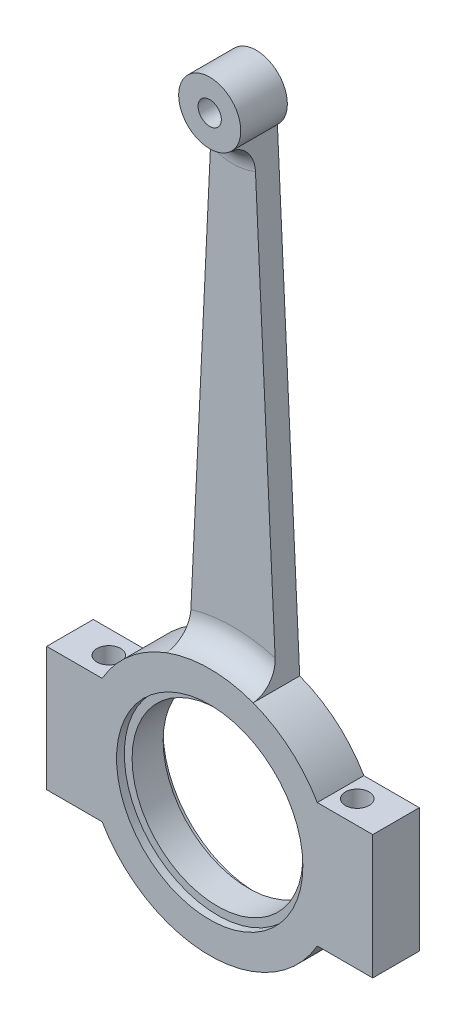
ISO-10303-21;
HEADER;
FILE_DESCRIPTION(('STEP AP214'),'2;1');
FILE_NAME('part.step','',(''),(''),'','','');
FILE_SCHEMA(('AUTOMOTIVE_DESIGN { 1 0 10303 214 1 1 1 1 }'));
ENDSEC;
DATA;
#1=APPLICATION_CONTEXT('core data for automotive mechanical design processes');
#2=APPLICATION_PROTOCOL_DEFINITION('international standard','automotive_design',2000,#1);
#3=PRODUCT_CONTEXT('',#1,'mechanical');
#4=PRODUCT('Part','Part','',(#3));
#5=PRODUCT_RELATED_PRODUCT_CATEGORY('part','',(#4));
#6=PRODUCT_DEFINITION_FORMATION('','',#4);
#7=PRODUCT_DEFINITION_CONTEXT('part definition',#1,'design');
#8=PRODUCT_DEFINITION('design','',#6,#7);
#9=PRODUCT_DEFINITION_SHAPE('','',#8);
#10=(LENGTH_UNIT() NAMED_UNIT(*) SI_UNIT(.MILLI.,.METRE.));
#11=(NAMED_UNIT(*) PLANE_ANGLE_UNIT() SI_UNIT($,.RADIAN.));
#12=(NAMED_UNIT(*) SI_UNIT($,.STERADIAN.) SOLID_ANGLE_UNIT());
#13=UNCERTAINTY_MEASURE_WITH_UNIT(LENGTH_MEASURE(1.E-05),#10,'distance_accuracy_value','');
#14=(GEOMETRIC_REPRESENTATION_CONTEXT(3) GLOBAL_UNCERTAINTY_ASSIGNED_CONTEXT((#13)) GLOBAL_UNIT_ASSIGNED_CONTEXT((#10,
#11,#12)) REPRESENTATION_CONTEXT('',''));
#15=CARTESIAN_POINT('',(0.,0.,0.));
#16=DIRECTION('',(0.,0.,1.));
#17=DIRECTION('',(1.,0.,0.));
#18=AXIS2_PLACEMENT_3D('',#15,#16,#17);
#19=CARTESIAN_POINT('',(0.,-123.825,9.525));
#20=DIRECTION('',(0.,0.,-1.));
#21=DIRECTION('',(-1.,0.,0.));
#22=AXIS2_PLACEMENT_3D('',#19,#20,#21);
#23=CYLINDRICAL_SURFACE('',#22,25.4);
#24=CARTESIAN_POINT('',(0.,-123.825,9.525));
#25=DIRECTION('',(0.,0.,1.));
#26=DIRECTION('',(1.,0.,0.));
#27=AXIS2_PLACEMENT_3D('',#24,#25,#26);
#28=CIRCLE('',#27,25.4);
#29=CARTESIAN_POINT('',(-8.87478990059472,-100.025880179715,9.525));
#30=VERTEX_POINT('',#29);
#31=CARTESIAN_POINT('',(-21.9970452561247,-111.125,9.525));
#32=VERTEX_POINT('',#31);
#33=EDGE_CURVE('E177',#30,#32,#28,.T.);
#34=ORIENTED_EDGE('',*,*,#33,.F.);
#35=DIRECTION('',(0.,0.,-1.));
#36=VECTOR('',#35,1.);
#37=CARTESIAN_POINT('',(-8.87478990059473,-100.025880179715,4.7625));
#38=LINE('',#37,#36);
#39=CARTESIAN_POINT('',(-8.87478990059473,-100.025880179715,0.));
#40=VERTEX_POINT('',#39);
#41=EDGE_CURVE('E282',#30,#40,#38,.T.);
#42=ORIENTED_EDGE('',*,*,#41,.T.);
#43=CARTESIAN_POINT('',(0.,-123.825,0.));
#44=DIRECTION('',(0.,0.,1.));
#45=DIRECTION('',(1.,0.,0.));
#46=AXIS2_PLACEMENT_3D('',#43,#44,#45);
#47=CIRCLE('',#46,25.4);
#48=CARTESIAN_POINT('',(-21.9970452561247,-111.125,0.));
#49=VERTEX_POINT('',#48);
#50=EDGE_CURVE('E214',#40,#49,#47,.T.);
#51=ORIENTED_EDGE('',*,*,#50,.T.);
#52=DIRECTION('',(0.,0.,-1.));
#53=VECTOR('',#52,1.);
#54=CARTESIAN_POINT('',(-21.9970452561247,-111.125,9.525));
#55=LINE('',#54,#53);
#56=EDGE_CURVE('E163',#32,#49,#55,.T.);
#57=ORIENTED_EDGE('',*,*,#56,.F.);
#58=EDGE_LOOP('',(#34,#42,#51,#57));
#59=FACE_BOUND('',#58,.T.);
#60=ADVANCED_FACE('F41',(#59),#23,.T.);
#61=CARTESIAN_POINT('',(0.,0.,9.525));
#62=DIRECTION('',(0.,0.,1.));
#63=DIRECTION('',(1.,0.,0.));
#64=AXIS2_PLACEMENT_3D('',#61,#62,#63);
#65=PLANE('',#64);
#66=CARTESIAN_POINT('',(0.,0.,9.525));
#67=DIRECTION('',(0.,0.,1.));
#68=DIRECTION('',(1.,0.,0.));
#69=AXIS2_PLACEMENT_3D('',#66,#67,#68);
#70=CIRCLE('',#69,6.35);
#71=CARTESIAN_POINT('',(-4.31825318171018,-4.65566208596049,9.525));
#72=VERTEX_POINT('',#71);
#73=CARTESIAN_POINT('',(4.31825318171018,-4.65566208596049,9.525));
#74=VERTEX_POINT('',#73);
#75=EDGE_CURVE('E306',#72,#74,#70,.T.);
#76=ORIENTED_EDGE('',*,*,#75,.T.);
#77=EDGE_CURVE('E311',#74,#72,#70,.T.);
#78=ORIENTED_EDGE('',*,*,#77,.T.);
#79=EDGE_LOOP('',(#76,#78));
#80=FACE_BOUND('',#79,.T.);
#81=CARTESIAN_POINT('',(0.,0.,9.525));
#82=DIRECTION('',(0.,0.,1.));
#83=DIRECTION('',(1.,0.,0.));
#84=AXIS2_PLACEMENT_3D('',#81,#82,#83);
#85=CIRCLE('',#84,2.38125);
#86=CARTESIAN_POINT('',(-2.38125,0.,9.525));
#87=VERTEX_POINT('',#86);
#88=EDGE_CURVE('E298',#87,#87,#85,.T.);
#89=ORIENTED_EDGE('',*,*,#88,.F.);
#90=EDGE_LOOP('',(#89));
#91=FACE_BOUND('',#90,.T.);
#92=ADVANCED_FACE('F349',(#80,#91),#65,.T.);
#93=CARTESIAN_POINT('',(0.,0.,0.));
#94=DIRECTION('',(0.,0.,1.));
#95=DIRECTION('',(1.,0.,0.));
#96=AXIS2_PLACEMENT_3D('',#93,#94,#95);
#97=PLANE('',#96);
#98=CARTESIAN_POINT('',(0.,0.,0.));
#99=DIRECTION('',(0.,0.,1.));
#100=DIRECTION('',(1.,0.,0.));
#101=AXIS2_PLACEMENT_3D('',#98,#99,#100);
#102=CIRCLE('',#101,6.35);
#103=CARTESIAN_POINT('',(4.31825318171018,-4.65566208596049,0.));
#104=VERTEX_POINT('',#103);
#105=CARTESIAN_POINT('',(-4.31825318171018,-4.65566208596049,0.));
#106=VERTEX_POINT('',#105);
#107=EDGE_CURVE('E302',#104,#106,#102,.T.);
#108=ORIENTED_EDGE('',*,*,#107,.F.);
#109=DIRECTION('',(0.0477229175808146,-0.998860612466812,0.));
#110=VECTOR('',#109,1.);
#111=CARTESIAN_POINT('',(4.08648983313829,0.195241673430361,0.));
#112=LINE('',#111,#110);
#113=CARTESIAN_POINT('',(8.87478990059473,-100.025880179715,0.));
#114=VERTEX_POINT('',#113);
#115=EDGE_CURVE('E162',#104,#114,#112,.T.);
#116=ORIENTED_EDGE('',*,*,#115,.T.);
#117=CARTESIAN_POINT('',(21.9970452561247,-111.125,0.));
#118=VERTEX_POINT('',#117);
#119=EDGE_CURVE('E216',#118,#114,#47,.T.);
#120=ORIENTED_EDGE('',*,*,#119,.F.);
#121=DIRECTION('',(1.,0.,0.));
#122=VECTOR('',#121,1.);
#123=CARTESIAN_POINT('',(0.,-111.125,0.));
#124=LINE('',#123,#122);
#125=CARTESIAN_POINT('',(33.3375,-111.125,0.));
#126=VERTEX_POINT('',#125);
#127=EDGE_CURVE('E157',#118,#126,#124,.T.);
#128=ORIENTED_EDGE('',*,*,#127,.T.);
#129=DIRECTION('',(0.,-1.,0.));
#130=VECTOR('',#129,1.);
#131=CARTESIAN_POINT('',(33.3375,0.,0.));
#132=LINE('',#131,#130);
#133=CARTESIAN_POINT('',(33.3375,-136.525,0.));
#134=VERTEX_POINT('',#133);
#135=EDGE_CURVE('E183',#126,#134,#132,.T.);
#136=ORIENTED_EDGE('',*,*,#135,.T.);
#137=DIRECTION('',(-1.,0.,0.));
#138=VECTOR('',#137,1.);
#139=CARTESIAN_POINT('',(0.,-136.525,0.));
#140=LINE('',#139,#138);
#141=CARTESIAN_POINT('',(21.9970452561247,-136.525,0.));
#142=VERTEX_POINT('',#141);
#143=EDGE_CURVE('E188',#134,#142,#140,.T.);
#144=ORIENTED_EDGE('',*,*,#143,.T.);
#145=CARTESIAN_POINT('',(0.,-123.825,0.));
#146=DIRECTION('',(0.,0.,1.));
#147=DIRECTION('',(1.,0.,0.));
#148=AXIS2_PLACEMENT_3D('',#145,#146,#147);
#149=CIRCLE('',#148,25.4);
#150=CARTESIAN_POINT('',(-21.9970452561247,-136.525,0.));
#151=VERTEX_POINT('',#150);
#152=EDGE_CURVE('E228',#151,#142,#149,.T.);
#153=ORIENTED_EDGE('',*,*,#152,.F.);
#154=DIRECTION('',(1.,0.,0.));
#155=VECTOR('',#154,1.);
#156=CARTESIAN_POINT('',(0.,-136.525,0.));
#157=LINE('',#156,#155);
#158=CARTESIAN_POINT('',(-33.3375,-136.525,0.));
#159=VERTEX_POINT('',#158);
#160=EDGE_CURVE('E225',#159,#151,#157,.T.);
#161=ORIENTED_EDGE('',*,*,#160,.F.);
#162=DIRECTION('',(0.,-1.,0.));
#163=VECTOR('',#162,1.);
#164=CARTESIAN_POINT('',(-33.3375,0.,0.));
#165=LINE('',#164,#163);
#166=CARTESIAN_POINT('',(-33.3375,-111.125,0.));
#167=VERTEX_POINT('',#166);
#168=EDGE_CURVE('E222',#167,#159,#165,.T.);
#169=ORIENTED_EDGE('',*,*,#168,.F.);
#170=DIRECTION('',(-1.,0.,0.));
#171=VECTOR('',#170,1.);
#172=CARTESIAN_POINT('',(1.35988300731615E-13,-111.125,0.));
#173=LINE('',#172,#171);
#174=EDGE_CURVE('E219',#49,#167,#173,.T.);
#175=ORIENTED_EDGE('',*,*,#174,.F.);
#176=ORIENTED_EDGE('',*,*,#50,.F.);
#177=DIRECTION('',(-0.0477229175808146,-0.998860612466812,0.));
#178=VECTOR('',#177,1.);
#179=CARTESIAN_POINT('',(-4.08648983313829,0.195241673430361,0.));
#180=LINE('',#179,#178);
#181=EDGE_CURVE('E278',#106,#40,#180,.T.);
#182=ORIENTED_EDGE('',*,*,#181,.F.);
#183=EDGE_LOOP('',(#108,#116,#120,#128,#136,#144,#153,#161,#169,#175,#176,#182));
#184=FACE_BOUND('',#183,.T.);
#185=CARTESIAN_POINT('',(0.,0.,0.));
#186=DIRECTION('',(0.,0.,1.));
#187=DIRECTION('',(1.,0.,0.));
#188=AXIS2_PLACEMENT_3D('',#185,#186,#187);
#189=CIRCLE('',#188,2.38125);
#190=CARTESIAN_POINT('',(-2.38125,0.,0.));
#191=VERTEX_POINT('',#190);
#192=EDGE_CURVE('E297',#191,#191,#189,.T.);
#193=ORIENTED_EDGE('',*,*,#192,.T.);
#194=EDGE_LOOP('',(#193));
#195=FACE_BOUND('',#194,.T.);
#196=CARTESIAN_POINT('',(0.,-123.825,0.));
#197=DIRECTION('',(0.,0.,-1.));
#198=DIRECTION('',(-1.,0.,0.));
#199=AXIS2_PLACEMENT_3D('',#196,#197,#198);
#200=CIRCLE('',#199,19.05);
#201=CARTESIAN_POINT('',(-19.05,-123.825,0.));
#202=VERTEX_POINT('',#201);
#203=EDGE_CURVE('E271',#202,#202,#200,.T.);
#204=ORIENTED_EDGE('',*,*,#203,.F.);
#205=EDGE_LOOP('',(#204));
#206=FACE_BOUND('',#205,.T.);
#207=ADVANCED_FACE('F346',(#184,#195,#206),#97,.F.);
#208=CARTESIAN_POINT('',(0.,0.,9.525));
#209=DIRECTION('',(0.,0.,-1.));
#210=DIRECTION('',(-1.,0.,0.));
#211=AXIS2_PLACEMENT_3D('',#208,#209,#210);
#212=CYLINDRICAL_SURFACE('',#211,6.35);
#213=ORIENTED_EDGE('',*,*,#77,.F.);
#214=DIRECTION('',(0.,0.,-1.));
#215=VECTOR('',#214,1.);
#216=CARTESIAN_POINT('',(4.31825318171018,-4.65566208596049,4.7625));
#217=LINE('',#216,#215);
#218=EDGE_CURVE('E63',#74,#104,#217,.T.);
#219=ORIENTED_EDGE('',*,*,#218,.T.);
#220=ORIENTED_EDGE('',*,*,#107,.T.);
#221=DIRECTION('',(0.,0.,-1.));
#222=VECTOR('',#221,1.);
#223=CARTESIAN_POINT('',(-4.31825318171018,-4.65566208596049,4.7625));
#224=LINE('',#223,#222);
#225=EDGE_CURVE('E71',#72,#106,#224,.T.);
#226=ORIENTED_EDGE('',*,*,#225,.F.);
#227=EDGE_LOOP('',(#213,#219,#220,#226));
#228=FACE_BOUND('',#227,.T.);
#229=ADVANCED_FACE('F341',(#228),#212,.T.);
#230=CARTESIAN_POINT('',(0.,0.,9.525));
#231=DIRECTION('',(0.,0.,-1.));
#232=DIRECTION('',(-1.,0.,0.));
#233=AXIS2_PLACEMENT_3D('',#230,#231,#232);
#234=CYLINDRICAL_SURFACE('',#233,2.38125);
#235=CARTESIAN_POINT('',(-2.38125,0.,9.525));
#236=CARTESIAN_POINT('',(-2.38125,0.,9.42578125));
#237=CARTESIAN_POINT('',(-2.38125,0.,9.3265625));
#238=CARTESIAN_POINT('',(-2.38125,0.,9.128125));
#239=CARTESIAN_POINT('',(-2.38125,0.,9.02890625));
#240=CARTESIAN_POINT('',(-2.38125,0.,8.83046875));
#241=CARTESIAN_POINT('',(-2.38125,0.,8.73125));
#242=CARTESIAN_POINT('',(-2.38125,0.,8.5328125));
#243=CARTESIAN_POINT('',(-2.38125,0.,8.43359375));
#244=CARTESIAN_POINT('',(-2.38125,0.,8.23515625));
#245=CARTESIAN_POINT('',(-2.38125,0.,8.1359375));
#246=CARTESIAN_POINT('',(-2.38125,0.,7.9375));
#247=CARTESIAN_POINT('',(-2.38125,0.,7.83828125));
#248=CARTESIAN_POINT('',(-2.38125,0.,7.63984375));
#249=CARTESIAN_POINT('',(-2.38125,0.,7.540625));
#250=CARTESIAN_POINT('',(-2.38125,0.,7.3421875));
#251=CARTESIAN_POINT('',(-2.38125,0.,7.24296875));
#252=CARTESIAN_POINT('',(-2.38125,0.,7.04453125));
#253=CARTESIAN_POINT('',(-2.38125,0.,6.9453125));
#254=CARTESIAN_POINT('',(-2.38125,0.,6.746875));
#255=CARTESIAN_POINT('',(-2.38125,0.,6.64765625));
#256=CARTESIAN_POINT('',(-2.38125,0.,6.44921875));
#257=CARTESIAN_POINT('',(-2.38125,0.,6.35));
#258=CARTESIAN_POINT('',(-2.38125,0.,6.1515625));
#259=CARTESIAN_POINT('',(-2.38125,0.,6.05234375));
#260=CARTESIAN_POINT('',(-2.38125,0.,5.85390625));
#261=CARTESIAN_POINT('',(-2.38125,0.,5.7546875));
#262=CARTESIAN_POINT('',(-2.38125,0.,5.55625));
#263=CARTESIAN_POINT('',(-2.38125,0.,5.45703125));
#264=CARTESIAN_POINT('',(-2.38125,0.,5.25859375));
#265=CARTESIAN_POINT('',(-2.38125,0.,5.159375));
#266=CARTESIAN_POINT('',(-2.38125,0.,4.9609375));
#267=CARTESIAN_POINT('',(-2.38125,0.,4.86171875));
#268=CARTESIAN_POINT('',(-2.38125,0.,4.66328125));
#269=CARTESIAN_POINT('',(-2.38125,0.,4.5640625));
#270=CARTESIAN_POINT('',(-2.38125,0.,4.365625));
#271=CARTESIAN_POINT('',(-2.38125,0.,4.26640625));
#272=CARTESIAN_POINT('',(-2.38125,0.,4.06796875));
#273=CARTESIAN_POINT('',(-2.38125,0.,3.96875));
#274=CARTESIAN_POINT('',(-2.38125,0.,3.7703125));
#275=CARTESIAN_POINT('',(-2.38125,0.,3.67109375));
#276=CARTESIAN_POINT('',(-2.38125,0.,3.47265625));
#277=CARTESIAN_POINT('',(-2.38125,0.,3.3734375));
#278=CARTESIAN_POINT('',(-2.38125,0.,3.175));
#279=CARTESIAN_POINT('',(-2.38125,0.,3.07578125));
#280=CARTESIAN_POINT('',(-2.38125,0.,2.87734375));
#281=CARTESIAN_POINT('',(-2.38125,0.,2.778125));
#282=CARTESIAN_POINT('',(-2.38125,0.,2.5796875));
#283=CARTESIAN_POINT('',(-2.38125,0.,2.48046875));
#284=CARTESIAN_POINT('',(-2.38125,0.,2.28203125));
#285=CARTESIAN_POINT('',(-2.38125,0.,2.1828125));
#286=CARTESIAN_POINT('',(-2.38125,0.,1.984375));
#287=CARTESIAN_POINT('',(-2.38125,0.,1.88515625));
#288=CARTESIAN_POINT('',(-2.38125,0.,1.68671875));
#289=CARTESIAN_POINT('',(-2.38125,0.,1.5875));
#290=CARTESIAN_POINT('',(-2.38125,0.,1.3890625));
#291=CARTESIAN_POINT('',(-2.38125,0.,1.28984375));
#292=CARTESIAN_POINT('',(-2.38125,0.,1.09140625));
#293=CARTESIAN_POINT('',(-2.38125,0.,0.992187500000001));
#294=CARTESIAN_POINT('',(-2.38125,0.,0.793750000000001));
#295=CARTESIAN_POINT('',(-2.38125,0.,0.69453125));
#296=CARTESIAN_POINT('',(-2.38125,0.,0.49609375));
#297=CARTESIAN_POINT('',(-2.38125,0.,0.396875));
#298=CARTESIAN_POINT('',(-2.38125,0.,0.1984375));
#299=CARTESIAN_POINT('',(-2.38125,0.,0.0992187500000001));
#300=CARTESIAN_POINT('',(-2.38125,0.,0.));
#301=B_SPLINE_CURVE_WITH_KNOTS('',3,(#235,#236,#237,#238,#239,#240,#241,#242,#243,#244,#245,
#246,#247,#248,#249,#250,#251,#252,#253,#254,#255,#256,#257,#258,#259,#260,#261,#262,#263,#264,
#265,#266,#267,#268,#269,#270,#271,#272,#273,#274,#275,#276,#277,#278,#279,#280,#281,#282,#283,
#284,#285,#286,#287,#288,#289,#290,#291,#292,#293,#294,#295,#296,#297,#298,#299,#300),
.UNSPECIFIED.,.F.,.F.,(4,2,2,2,2,2,2,2,2,2,2,2,2,2,2,2,2,2,2,2,2,2,2,2,2,2,2,2,2,2,2,2,4),(0.,
0.29765625,0.5953125,0.892968750000001,1.190625,1.48828125,1.7859375,2.08359375,2.38125,
2.67890625,2.9765625,3.27421875,3.571875,3.86953125,4.1671875,4.46484375,4.7625,5.06015625,
5.3578125,5.65546875,5.953125,6.25078125,6.5484375,6.84609375,7.14375,7.44140625,7.7390625,
8.03671875,8.334375,8.63203125,8.9296875,9.22734375,9.525),.UNSPECIFIED.);
#302=EDGE_CURVE('BSEAM345',#87,#191,#301,.T.);
#303=ORIENTED_EDGE('',*,*,#88,.T.);
#304=ORIENTED_EDGE('',*,*,#192,.F.);
#305=ORIENTED_EDGE('',*,*,#302,.T.);
#306=ORIENTED_EDGE('',*,*,#302,.F.);
#307=EDGE_LOOP('',(#303,#305,#304,#306));
#308=FACE_BOUND('',#307,.T.);
#309=ADVANCED_FACE('F345',(#308),#234,.F.);
#310=CARTESIAN_POINT('',(4.08648983313829,0.195241673430361,4.7625));
#311=DIRECTION('',(0.998860612466812,0.0477229175808146,0.));
#312=DIRECTION('',(-0.0477229175808146,0.998860612466812,0.));
#313=AXIS2_PLACEMENT_3D('',#310,#311,#312);
#314=PLANE('',#313);
#315=ORIENTED_EDGE('',*,*,#115,.F.);
#316=ORIENTED_EDGE('',*,*,#218,.F.);
#317=CARTESIAN_POINT('',(4.31825318171018,-4.65566208596049,9.525));
#318=CARTESIAN_POINT('',(4.31875457990315,-4.66615655971673,9.39602428371671));
#319=CARTESIAN_POINT('',(4.3195663927523,-4.68314814197578,9.26763693325829));
#320=CARTESIAN_POINT('',(4.32177359394429,-4.72934578550267,9.01325012501161));
#321=CARTESIAN_POINT('',(4.32316821076106,-4.75853569840767,8.88724773963512));
#322=CARTESIAN_POINT('',(4.32649125689037,-4.82808844288018,8.6395413707916));
#323=CARTESIAN_POINT('',(4.32841510156513,-4.86835531606254,8.51781016283218));
#324=CARTESIAN_POINT('',(4.33275690240574,-4.9592310224676,8.278257288787));
#325=CARTESIAN_POINT('',(4.33517501296103,-5.0098430871256,8.16043685767501));
#326=CARTESIAN_POINT('',(4.34044520752671,-5.12015046225148,7.92992877362391));
#327=CARTESIAN_POINT('',(4.34329489748226,-5.17979566415112,7.81721700667056));
#328=CARTESIAN_POINT('',(4.34939372547341,-5.30744668322921,7.59669218417544));
#329=CARTESIAN_POINT('',(4.35264283342695,-5.37545187077764,7.48887876055289));
#330=CARTESIAN_POINT('',(4.36294687008295,-5.59111966492824,7.1727364566328));
#331=CARTESIAN_POINT('',(4.37054852676269,-5.7502255166196,6.97213201296029));
#332=CARTESIAN_POINT('',(4.38820764208135,-6.11983818149802,6.56429948857492));
#333=CARTESIAN_POINT('',(4.39846311892126,-6.33448959840072,6.36086353860913));
#334=CARTESIAN_POINT('',(4.4202504071577,-6.79050664796587,5.98670125713834));
#335=CARTESIAN_POINT('',(4.43178249524672,-7.03187807191762,5.8159820386361));
#336=CARTESIAN_POINT('',(4.45787987539549,-7.57810714676506,5.48444679451407));
#337=CARTESIAN_POINT('',(4.4726306088904,-7.88684616441015,5.33000339018593));
#338=CARTESIAN_POINT('',(4.50313729546689,-8.52536386581687,5.0740021584721));
#339=CARTESIAN_POINT('',(4.51889248442239,-8.85512655610014,4.9724046556787));
#340=CARTESIAN_POINT('',(4.54485153965833,-9.39846043270398,4.8542167897515));
#341=CARTESIAN_POINT('',(4.55487857523549,-9.60833047849215,4.81998107064269));
#342=CARTESIAN_POINT('',(4.57504024201358,-10.0303225914473,4.77412500130972));
#343=CARTESIAN_POINT('',(4.58517476932753,-10.2424424842166,4.76248451736574));
#344=CARTESIAN_POINT('',(4.59531650433198,-10.4547132369607,4.7625));
#345=B_SPLINE_CURVE_WITH_KNOTS('',3,(#317,#318,#319,#320,#321,#322,#323,#324,#325,#326,#327,
#328,#329,#330,#331,#332,#333,#334,#335,#336,#337,#338,#339,#340,#341,#342,#343,#344),
.UNSPECIFIED.,.F.,.F.,(4,2,2,2,2,2,2,2,2,2,2,2,2,4),(0.,0.387961975392442,0.775411978815411,
1.15960586654646,1.54391994539636,1.92617536618843,2.30840201513701,3.07426652295181,
3.95883000464349,4.84358558321911,5.87553388602948,6.90670630498094,7.54422925826817,
8.18118387883585),.UNSPECIFIED.);
#346=CARTESIAN_POINT('',(4.59531650433198,-10.4547132369607,4.7625));
#347=VERTEX_POINT('',#346);
#348=EDGE_CURVE('E56',#74,#347,#345,.T.);
#349=ORIENTED_EDGE('',*,*,#348,.T.);
#350=DIRECTION('',(0.0477229175808146,-0.998860612466812,0.));
#351=VECTOR('',#350,1.);
#352=CARTESIAN_POINT('',(4.08648983313829,0.195241673430361,4.7625));
#353=LINE('',#352,#351);
#354=CARTESIAN_POINT('',(8.61547557594445,-94.5983229750871,4.7625));
#355=VERTEX_POINT('',#354);
#356=EDGE_CURVE('E273',#347,#355,#353,.T.);
#357=ORIENTED_EDGE('',*,*,#356,.T.);
#358=CARTESIAN_POINT('',(8.61547557594445,-94.5983229750871,4.7625));
#359=CARTESIAN_POINT('',(8.62312525275805,-94.7584339082518,4.76248923608136));
#360=CARTESIAN_POINT('',(8.6307746503763,-94.9185389977411,4.76926912822186));
#361=CARTESIAN_POINT('',(8.6460191050727,-95.2376118065018,4.79625715921481));
#362=CARTESIAN_POINT('',(8.65361416382361,-95.3965795607848,4.81646488289401));
#363=CARTESIAN_POINT('',(8.66870098007606,-95.7123529310231,4.87017098574402));
#364=CARTESIAN_POINT('',(8.67619267558521,-95.8691572494517,4.90367701019561));
#365=CARTESIAN_POINT('',(8.69101531836047,-96.1794013583917,4.98375432883136));
#366=CARTESIAN_POINT('',(8.6983462665205,-96.332841167613,5.03032555034045));
#367=CARTESIAN_POINT('',(8.71279779264627,-96.6353176499576,5.13628050699879));
#368=CARTESIAN_POINT('',(8.71991827954608,-96.7843524170328,5.195669698776));
#369=CARTESIAN_POINT('',(8.73389520409043,-97.0768952899017,5.32693845320405));
#370=CARTESIAN_POINT('',(8.7407515487509,-97.2204014494998,5.39882236607628));
#371=CARTESIAN_POINT('',(8.75414072457467,-97.5006424959762,5.55462916405372));
#372=CARTESIAN_POINT('',(8.76067372715467,-97.6373809706778,5.6385455762587));
#373=CARTESIAN_POINT('',(8.77336618318375,-97.9030393806323,5.81797720128511));
#374=CARTESIAN_POINT('',(8.77952565776542,-98.0319597581993,5.9134917570144));
#375=CARTESIAN_POINT('',(8.79130601960012,-98.2785276554232,6.11368525887864));
#376=CARTESIAN_POINT('',(8.79693481919399,-98.3963407836811,6.21815965080289));
#377=CARTESIAN_POINT('',(8.80772708687963,-98.6222274573558,6.43709928651617));
#378=CARTESIAN_POINT('',(8.81289074708966,-98.7303050238882,6.55156036665322));
#379=CARTESIAN_POINT('',(8.8227061159814,-98.9357447974769,6.78984707727064));
#380=CARTESIAN_POINT('',(8.82735759077145,-99.0331021090829,6.91367694285881));
#381=CARTESIAN_POINT('',(8.83609491838271,-99.2159780280652,7.16980439342414));
#382=CARTESIAN_POINT('',(8.84018083291826,-99.3014979271484,7.30210105219133));
#383=CARTESIAN_POINT('',(8.84749591399281,-99.4546056316385,7.5654321005549));
#384=CARTESIAN_POINT('',(8.85076326975362,-99.5229927534203,7.69600098382801));
#385=CARTESIAN_POINT('',(8.85672382324819,-99.6477496294884,7.9627656792442));
#386=CARTESIAN_POINT('',(8.8594170888162,-99.7041208035734,8.09896082431802));
#387=CARTESIAN_POINT('',(8.86419234419808,-99.8040688947049,8.37565620103864));
#388=CARTESIAN_POINT('',(8.86627559548663,-99.8476722149436,8.51614687528526));
#389=CARTESIAN_POINT('',(8.86981079025144,-99.9216653190322,8.80050425224564));
#390=CARTESIAN_POINT('',(8.87126315003218,-99.9520638163088,8.94436866247328));
#391=CARTESIAN_POINT('',(8.87295295316604,-99.9874321022143,9.1615262459966));
#392=CARTESIAN_POINT('',(8.87343437208158,-99.9975084013427,9.23401853237336));
#393=CARTESIAN_POINT('',(8.87423422083596,-100.014249570097,9.37929831707211));
#394=CARTESIAN_POINT('',(8.87455286824809,-100.020918993623,9.45208528954497));
#395=CARTESIAN_POINT('',(8.87478990059473,-100.025880179715,9.525));
#396=B_SPLINE_CURVE_WITH_KNOTS('',3,(#358,#359,#360,#361,#362,#363,#364,#365,#366,#367,#368,
#369,#370,#371,#372,#373,#374,#375,#376,#377,#378,#379,#380,#381,#382,#383,#384,#385,#386,#387,
#388,#389,#390,#391,#392,#393,#394,#395),.UNSPECIFIED.,.F.,.F.,(4,2,2,2,2,2,2,2,2,2,2,2,2,2,2,2,
2,2,4),(0.,0.480729396406373,0.96144392989931,1.44243523059978,1.92342385584213,
2.40461764390769,2.88597930349841,3.36708297870048,3.84815940970815,4.32024803633303,
4.79214077169175,5.26424811295124,5.73630389684432,6.17801575546164,6.61967539264589,
7.06041514623858,7.50086362678896,7.72036663567597,7.93957546660449),.UNSPECIFIED.);
#397=CARTESIAN_POINT('',(8.87478990059472,-100.025880179715,9.525));
#398=VERTEX_POINT('',#397);
#399=EDGE_CURVE('E326',#355,#398,#396,.T.);
#400=ORIENTED_EDGE('',*,*,#399,.T.);
#401=DIRECTION('',(0.,0.,-1.));
#402=VECTOR('',#401,1.);
#403=CARTESIAN_POINT('',(8.87478990059473,-100.025880179715,4.7625));
#404=LINE('',#403,#402);
#405=EDGE_CURVE('E168',#398,#114,#404,.T.);
#406=ORIENTED_EDGE('',*,*,#405,.T.);
#407=EDGE_LOOP('',(#315,#316,#349,#357,#400,#406));
#408=FACE_BOUND('',#407,.T.);
#409=ADVANCED_FACE('F355',(#408),#314,.T.);
#410=CARTESIAN_POINT('',(-4.08648983313829,0.195241673430361,4.7625));
#411=DIRECTION('',(0.998860612466812,-0.0477229175808146,0.));
#412=DIRECTION('',(0.0477229175808146,0.998860612466812,0.));
#413=AXIS2_PLACEMENT_3D('',#410,#411,#412);
#414=PLANE('',#413);
#415=ORIENTED_EDGE('',*,*,#181,.T.);
#416=ORIENTED_EDGE('',*,*,#41,.F.);
#417=CARTESIAN_POINT('',(-8.87478990059472,-100.025880179715,9.525));
#418=CARTESIAN_POINT('',(-8.87434867951005,-100.016645237988,9.38893524089033));
#419=CARTESIAN_POINT('',(-8.87362116296155,-100.001418012536,9.2532905942126));
#420=CARTESIAN_POINT('',(-8.87160734570927,-99.9592679756991,8.98387523371857));
#421=CARTESIAN_POINT('',(-8.87032121430255,-99.9323487077721,8.85010396481458));
#422=CARTESIAN_POINT('',(-8.86720885975302,-99.8672058261305,8.58582439112954));
#423=CARTESIAN_POINT('',(-8.8653844418541,-99.8290199969254,8.45530673660665));
#424=CARTESIAN_POINT('',(-8.86121434500341,-99.7417381267992,8.1979808596696));
#425=CARTESIAN_POINT('',(-8.85886864275941,-99.6926415983622,8.0711728032957));
#426=CARTESIAN_POINT('',(-8.85368262485091,-99.5840960758555,7.82222467399093));
#427=CARTESIAN_POINT('',(-8.85084280009843,-99.5246573567798,7.70008011336885));
#428=CARTESIAN_POINT('',(-8.84469489918246,-99.3959792208735,7.46106187714108));
#429=CARTESIAN_POINT('',(-8.84138664929434,-99.3267361679137,7.34419017838042));
#430=CARTESIAN_POINT('',(-8.83080184551369,-99.1051918004874,7.00249456465782));
#431=CARTESIAN_POINT('',(-8.82286305878151,-98.939029675883,6.78648661403097));
#432=CARTESIAN_POINT('',(-8.80511666970877,-98.5675903348524,6.37424048574314));
#433=CARTESIAN_POINT('',(-8.7952432091448,-98.3609346782826,6.17925757149227));
#434=CARTESIAN_POINT('',(-8.77416586136363,-97.9197769791913,5.82384508687113));
#435=CARTESIAN_POINT('',(-8.76296142790236,-97.6852635035533,5.66342977991127));
#436=CARTESIAN_POINT('',(-8.73865509579534,-97.1765218128525,5.36958522359116));
#437=CARTESIAN_POINT('',(-8.72547415269146,-96.9006391642416,5.23902873536654));
#438=CARTESIAN_POINT('',(-8.6982891249586,-96.331645170838,5.02378346131798));
#439=CARTESIAN_POINT('',(-8.68428538299513,-96.0385409981779,4.93907572917403));
#440=CARTESIAN_POINT('',(-8.66107482132763,-95.5527342407926,4.83975026743968));
#441=CARTESIAN_POINT('',(-8.65200195032678,-95.3628352584138,4.81080700474984));
#442=CARTESIAN_POINT('',(-8.63377914129277,-94.9814242484571,4.77219591720216));
#443=CARTESIAN_POINT('',(-8.62462936321492,-94.7899155688108,4.7624949252916));
#444=CARTESIAN_POINT('',(-8.61547557594445,-94.5983229750871,4.7625));
#445=B_SPLINE_CURVE_WITH_KNOTS('',3,(#417,#418,#419,#420,#421,#422,#423,#424,#425,#426,#427,
#428,#429,#430,#431,#432,#433,#434,#435,#436,#437,#438,#439,#440,#441,#442,#443,#444),
.UNSPECIFIED.,.F.,.F.,(4,2,2,2,2,2,2,2,2,2,2,2,2,4),(0.,0.408986664031376,0.817849464576019,
1.22535635862711,1.63288146471716,2.04000398153194,2.44727788512393,3.26149027486964,
4.11083609124707,4.9605316995087,5.87306053242111,6.78521198783957,7.36123316719728,
7.9362606184979),.UNSPECIFIED.);
#446=CARTESIAN_POINT('',(-8.61547557594445,-94.5983229750871,4.7625));
#447=VERTEX_POINT('',#446);
#448=EDGE_CURVE('E319',#30,#447,#445,.T.);
#449=ORIENTED_EDGE('',*,*,#448,.T.);
#450=DIRECTION('',(-0.0477229175808146,-0.998860612466812,0.));
#451=VECTOR('',#450,1.);
#452=CARTESIAN_POINT('',(-4.08648983313829,0.195241673430361,4.7625));
#453=LINE('',#452,#451);
#454=CARTESIAN_POINT('',(-4.59531650433198,-10.4547132369607,4.7625));
#455=VERTEX_POINT('',#454);
#456=EDGE_CURVE('E277',#455,#447,#453,.T.);
#457=ORIENTED_EDGE('',*,*,#456,.F.);
#458=CARTESIAN_POINT('',(-4.59531650433198,-10.4547132369607,4.7625));
#459=CARTESIAN_POINT('',(-4.58714075817885,-10.2835914526301,4.76248517390263));
#460=CARTESIAN_POINT('',(-4.57896657097548,-10.1125022977696,4.77005327979247));
#461=CARTESIAN_POINT('',(-4.56268279864319,-9.77167613646969,4.79994863674258));
#462=CARTESIAN_POINT('',(-4.55457319033612,-9.60193864490173,4.82227032632817));
#463=CARTESIAN_POINT('',(-4.53849680822307,-9.26545324757668,4.88118245584279));
#464=CARTESIAN_POINT('',(-4.53052969255005,-9.0986981863996,4.91773195026895));
#465=CARTESIAN_POINT('',(-4.514769652183,-8.76883395404457,5.00459359861634));
#466=CARTESIAN_POINT('',(-4.50697674193964,-8.6057250853254,5.05490688972254));
#467=CARTESIAN_POINT('',(-4.4839556564841,-8.12388414425482,5.22558239361339));
#468=CARTESIAN_POINT('',(-4.46905227655967,-7.811950173036,5.36580313207992));
#469=CARTESIAN_POINT('',(-4.44049700601689,-7.2142764248789,5.69498794374526));
#470=CARTESIAN_POINT('',(-4.42684712261486,-6.92857865981736,5.88402840827724));
#471=CARTESIAN_POINT('',(-4.40738890580354,-6.52131004869874,6.20457824827974));
#472=CARTESIAN_POINT('',(-4.40096730314879,-6.38690322099619,6.320012543751));
#473=CARTESIAN_POINT('',(-4.38863253014455,-6.12873126625801,6.56224233285632));
#474=CARTESIAN_POINT('',(-4.38271944660037,-6.00496795609345,6.68903975868702));
#475=CARTESIAN_POINT('',(-4.36586182283569,-5.65213084445194,7.08540206727003));
#476=CARTESIAN_POINT('',(-4.35576417857182,-5.44078292933751,7.37150267115446));
#477=CARTESIAN_POINT('',(-4.34125314040943,-5.13706083519135,7.88788743126528));
#478=CARTESIAN_POINT('',(-4.33604609449103,-5.02807518764809,8.10840824133516));
#479=CARTESIAN_POINT('',(-4.3295779986207,-4.8926952375101,8.44992445969258));
#480=CARTESIAN_POINT('',(-4.32764715262115,-4.85228182367326,8.5654145180153));
#481=CARTESIAN_POINT('',(-4.32426765975766,-4.78154762546058,8.79942530225776));
#482=CARTESIAN_POINT('',(-4.32281874671978,-4.7512212699528,8.91794431618794));
#483=CARTESIAN_POINT('',(-4.3208274892905,-4.70954341964066,9.11797885627896));
#484=CARTESIAN_POINT('',(-4.32014366439585,-4.69523067876659,9.19888622371295));
#485=CARTESIAN_POINT('',(-4.31901628330135,-4.67163412122933,9.36145232704697));
#486=CARTESIAN_POINT('',(-4.31857278767696,-4.66235157243613,9.44311124710766));
#487=CARTESIAN_POINT('',(-4.31825318171018,-4.65566208596049,9.525));
#488=B_SPLINE_CURVE_WITH_KNOTS('',3,(#458,#459,#460,#461,#462,#463,#464,#465,#466,#467,#468,
#469,#470,#471,#472,#473,#474,#475,#476,#477,#478,#479,#480,#481,#482,#483,#484,#485,#486,#487),
.UNSPECIFIED.,.F.,.F.,(4,2,2,2,2,2,2,2,2,2,2,2,2,2,4),(0.,0.513734025165501,1.02727450477661,
1.53934788900581,2.05146359427041,3.07362295869349,4.09739155573661,4.62863735949823,
5.15997366878707,6.21991819175655,6.95504155977944,7.32176746009127,7.68829047825299,
7.93464296313046,8.18105751279823),.UNSPECIFIED.);
#489=EDGE_CURVE('E11',#455,#72,#488,.T.);
#490=ORIENTED_EDGE('',*,*,#489,.T.);
#491=ORIENTED_EDGE('',*,*,#225,.T.);
#492=EDGE_LOOP('',(#415,#416,#449,#457,#490,#491));
#493=FACE_BOUND('',#492,.T.);
#494=ADVANCED_FACE('F332',(#493),#414,.F.);
#495=CARTESIAN_POINT('',(0.,0.,4.7625));
#496=DIRECTION('',(0.,0.,1.));
#497=DIRECTION('',(1.,0.,0.));
#498=AXIS2_PLACEMENT_3D('',#495,#496,#497);
#499=PLANE('',#498);
#500=ORIENTED_EDGE('',*,*,#456,.T.);
#501=CARTESIAN_POINT('',(0.,-123.825,4.7625));
#502=DIRECTION('',(0.,0.,1.));
#503=DIRECTION('',(1.,0.,0.));
#504=AXIS2_PLACEMENT_3D('',#501,#502,#503);
#505=CIRCLE('',#504,30.4700684166981);
#506=EDGE_CURVE('E316',#447,#355,#505,.F.);
#507=ORIENTED_EDGE('',*,*,#506,.T.);
#508=ORIENTED_EDGE('',*,*,#356,.F.);
#509=CARTESIAN_POINT('',(0.,0.,4.7625));
#510=DIRECTION('',(0.,0.,1.));
#511=DIRECTION('',(1.,0.,0.));
#512=AXIS2_PLACEMENT_3D('',#509,#510,#511);
#513=CIRCLE('',#512,11.4200684166981);
#514=EDGE_CURVE('E310',#347,#455,#513,.F.);
#515=ORIENTED_EDGE('',*,*,#514,.T.);
#516=EDGE_LOOP('',(#500,#507,#508,#515));
#517=FACE_BOUND('',#516,.T.);
#518=ADVANCED_FACE('F381',(#517),#499,.T.);
#519=CARTESIAN_POINT('',(0.,-123.825,9.525));
#520=DIRECTION('',(0.,0.,-1.));
#521=DIRECTION('',(-1.,0.,0.));
#522=AXIS2_PLACEMENT_3D('',#519,#520,#521);
#523=CYLINDRICAL_SURFACE('',#522,17.4625);
#524=CARTESIAN_POINT('',(0.,-123.825,7.9375));
#525=DIRECTION('',(0.,0.,1.));
#526=DIRECTION('',(1.,0.,0.));
#527=AXIS2_PLACEMENT_3D('',#524,#525,#526);
#528=CIRCLE('',#527,17.4625);
#529=CARTESIAN_POINT('',(-17.4625,-123.825,7.9375));
#530=VERTEX_POINT('',#529);
#531=EDGE_CURVE('E215',#530,#530,#528,.T.);
#532=CARTESIAN_POINT('',(0.,-123.825,1.5875));
#533=DIRECTION('',(0.,0.,-1.));
#534=DIRECTION('',(-1.,0.,0.));
#535=AXIS2_PLACEMENT_3D('',#532,#533,#534);
#536=CIRCLE('',#535,17.4625);
#537=CARTESIAN_POINT('',(-17.4625,-123.825,1.5875));
#538=VERTEX_POINT('',#537);
#539=EDGE_CURVE('E262',#538,#538,#536,.T.);
#540=CARTESIAN_POINT('',(-17.4625,-123.825,7.9375));
#541=CARTESIAN_POINT('',(-17.4625,-123.825,7.87135416666667));
#542=CARTESIAN_POINT('',(-17.4625,-123.825,7.80520833333333));
#543=CARTESIAN_POINT('',(-17.4625,-123.825,7.67291666666667));
#544=CARTESIAN_POINT('',(-17.4625,-123.825,7.60677083333333));
#545=CARTESIAN_POINT('',(-17.4625,-123.825,7.47447916666667));
#546=CARTESIAN_POINT('',(-17.4625,-123.825,7.40833333333333));
#547=CARTESIAN_POINT('',(-17.4625,-123.825,7.27604166666667));
#548=CARTESIAN_POINT('',(-17.4625,-123.825,7.20989583333333));
#549=CARTESIAN_POINT('',(-17.4625,-123.825,7.07760416666667));
#550=CARTESIAN_POINT('',(-17.4625,-123.825,7.01145833333333));
#551=CARTESIAN_POINT('',(-17.4625,-123.825,6.87916666666667));
#552=CARTESIAN_POINT('',(-17.4625,-123.825,6.81302083333333));
#553=CARTESIAN_POINT('',(-17.4625,-123.825,6.68072916666667));
#554=CARTESIAN_POINT('',(-17.4625,-123.825,6.61458333333333));
#555=CARTESIAN_POINT('',(-17.4625,-123.825,6.48229166666667));
#556=CARTESIAN_POINT('',(-17.4625,-123.825,6.41614583333333));
#557=CARTESIAN_POINT('',(-17.4625,-123.825,6.28385416666667));
#558=CARTESIAN_POINT('',(-17.4625,-123.825,6.21770833333333));
#559=CARTESIAN_POINT('',(-17.4625,-123.825,6.08541666666667));
#560=CARTESIAN_POINT('',(-17.4625,-123.825,6.01927083333333));
#561=CARTESIAN_POINT('',(-17.4625,-123.825,5.88697916666667));
#562=CARTESIAN_POINT('',(-17.4625,-123.825,5.82083333333333));
#563=CARTESIAN_POINT('',(-17.4625,-123.825,5.68854166666667));
#564=CARTESIAN_POINT('',(-17.4625,-123.825,5.62239583333333));
#565=CARTESIAN_POINT('',(-17.4625,-123.825,5.49010416666667));
#566=CARTESIAN_POINT('',(-17.4625,-123.825,5.42395833333333));
#567=CARTESIAN_POINT('',(-17.4625,-123.825,5.29166666666667));
#568=CARTESIAN_POINT('',(-17.4625,-123.825,5.22552083333333));
#569=CARTESIAN_POINT('',(-17.4625,-123.825,5.09322916666667));
#570=CARTESIAN_POINT('',(-17.4625,-123.825,5.02708333333333));
#571=CARTESIAN_POINT('',(-17.4625,-123.825,4.89479166666667));
#572=CARTESIAN_POINT('',(-17.4625,-123.825,4.82864583333333));
#573=CARTESIAN_POINT('',(-17.4625,-123.825,4.69635416666667));
#574=CARTESIAN_POINT('',(-17.4625,-123.825,4.63020833333333));
#575=CARTESIAN_POINT('',(-17.4625,-123.825,4.49791666666667));
#576=CARTESIAN_POINT('',(-17.4625,-123.825,4.43177083333333));
#577=CARTESIAN_POINT('',(-17.4625,-123.825,4.29947916666667));
#578=CARTESIAN_POINT('',(-17.4625,-123.825,4.23333333333333));
#579=CARTESIAN_POINT('',(-17.4625,-123.825,4.10104166666667));
#580=CARTESIAN_POINT('',(-17.4625,-123.825,4.03489583333333));
#581=CARTESIAN_POINT('',(-17.4625,-123.825,3.90260416666667));
#582=CARTESIAN_POINT('',(-17.4625,-123.825,3.83645833333333));
#583=CARTESIAN_POINT('',(-17.4625,-123.825,3.70416666666667));
#584=CARTESIAN_POINT('',(-17.4625,-123.825,3.63802083333333));
#585=CARTESIAN_POINT('',(-17.4625,-123.825,3.50572916666667));
#586=CARTESIAN_POINT('',(-17.4625,-123.825,3.43958333333333));
#587=CARTESIAN_POINT('',(-17.4625,-123.825,3.30729166666667));
#588=CARTESIAN_POINT('',(-17.4625,-123.825,3.24114583333333));
#589=CARTESIAN_POINT('',(-17.4625,-123.825,3.10885416666667));
#590=CARTESIAN_POINT('',(-17.4625,-123.825,3.04270833333333));
#591=CARTESIAN_POINT('',(-17.4625,-123.825,2.91041666666667));
#592=CARTESIAN_POINT('',(-17.4625,-123.825,2.84427083333334));
#593=CARTESIAN_POINT('',(-17.4625,-123.825,2.71197916666667));
#594=CARTESIAN_POINT('',(-17.4625,-123.825,2.64583333333333));
#595=CARTESIAN_POINT('',(-17.4625,-123.825,2.51354166666667));
#596=CARTESIAN_POINT('',(-17.4625,-123.825,2.44739583333333));
#597=CARTESIAN_POINT('',(-17.4625,-123.825,2.31510416666667));
#598=CARTESIAN_POINT('',(-17.4625,-123.825,2.24895833333333));
#599=CARTESIAN_POINT('',(-17.4625,-123.825,2.11666666666667));
#600=CARTESIAN_POINT('',(-17.4625,-123.825,2.05052083333333));
#601=CARTESIAN_POINT('',(-17.4625,-123.825,1.91822916666667));
#602=CARTESIAN_POINT('',(-17.4625,-123.825,1.85208333333333));
#603=CARTESIAN_POINT('',(-17.4625,-123.825,1.71979166666667));
#604=CARTESIAN_POINT('',(-17.4625,-123.825,1.65364583333334));
#605=CARTESIAN_POINT('',(-17.4625,-123.825,1.5875));
#606=B_SPLINE_CURVE_WITH_KNOTS('',3,(#540,#541,#542,#543,#544,#545,#546,#547,#548,#549,#550,
#551,#552,#553,#554,#555,#556,#557,#558,#559,#560,#561,#562,#563,#564,#565,#566,#567,#568,#569,
#570,#571,#572,#573,#574,#575,#576,#577,#578,#579,#580,#581,#582,#583,#584,#585,#586,#587,#588,
#589,#590,#591,#592,#593,#594,#595,#596,#597,#598,#599,#600,#601,#602,#603,#604,#605),
.UNSPECIFIED.,.F.,.F.,(4,2,2,2,2,2,2,2,2,2,2,2,2,2,2,2,2,2,2,2,2,2,2,2,2,2,2,2,2,2,2,2,4),(0.,
0.198437499999999,0.396875,0.595312499999999,0.793749999999999,0.992187499999998,1.190625,
1.3890625,1.5875,1.7859375,1.984375,2.1828125,2.38125,2.5796875,2.778125,2.9765625,3.175,
3.3734375,3.571875,3.7703125,3.96875,4.1671875,4.365625,4.5640625,4.7625,4.9609375,5.159375,
5.3578125,5.55625,5.7546875,5.953125,6.1515625,6.35),.UNSPECIFIED.);
#607=EDGE_CURVE('BSEAM464',#530,#538,#606,.T.);
#608=ORIENTED_EDGE('',*,*,#531,.T.);
#609=ORIENTED_EDGE('',*,*,#539,.T.);
#610=ORIENTED_EDGE('',*,*,#607,.T.);
#611=ORIENTED_EDGE('',*,*,#607,.F.);
#612=EDGE_LOOP('',(#608,#610,#609,#611));
#613=FACE_BOUND('',#612,.T.);
#614=ADVANCED_FACE('F464',(#613),#523,.F.);
#615=CARTESIAN_POINT('',(0.,-111.125,9.525));
#616=DIRECTION('',(0.,1.,0.));
#617=DIRECTION('',(0.,0.,1.));
#618=AXIS2_PLACEMENT_3D('',#615,#616,#617);
#619=PLANE('',#618);
#620=CARTESIAN_POINT('',(25.4000000000001,-111.125,4.76250000000028));
#621=DIRECTION('',(0.,1.,0.));
#622=DIRECTION('',(0.,0.,1.));
#623=AXIS2_PLACEMENT_3D('',#620,#621,#622);
#624=CIRCLE('',#623,2.42569999999999);
#625=CARTESIAN_POINT('',(25.4000000000001,-111.125,7.18820000000026));
#626=VERTEX_POINT('',#625);
#627=EDGE_CURVE('E272',#626,#626,#624,.T.);
#628=ORIENTED_EDGE('',*,*,#627,.F.);
#629=EDGE_LOOP('',(#628));
#630=FACE_BOUND('',#629,.T.);
#631=ORIENTED_EDGE('',*,*,#127,.F.);
#632=DIRECTION('',(0.,0.,-1.));
#633=VECTOR('',#632,1.);
#634=CARTESIAN_POINT('',(21.9970452561247,-111.125,9.525));
#635=LINE('',#634,#633);
#636=CARTESIAN_POINT('',(21.9970452561247,-111.125,9.525));
#637=VERTEX_POINT('',#636);
#638=EDGE_CURVE('E150',#637,#118,#635,.T.);
#639=ORIENTED_EDGE('',*,*,#638,.F.);
#640=DIRECTION('',(1.,0.,0.));
#641=VECTOR('',#640,1.);
#642=CARTESIAN_POINT('',(0.,-111.125,9.525));
#643=LINE('',#642,#641);
#644=CARTESIAN_POINT('',(33.3375,-111.125,9.525));
#645=VERTEX_POINT('',#644);
#646=EDGE_CURVE('E154',#637,#645,#643,.T.);
#647=ORIENTED_EDGE('',*,*,#646,.T.);
#648=DIRECTION('',(0.,0.,-1.));
#649=VECTOR('',#648,1.);
#650=CARTESIAN_POINT('',(33.3375,-111.125,9.525));
#651=LINE('',#650,#649);
#652=EDGE_CURVE('E211',#645,#126,#651,.T.);
#653=ORIENTED_EDGE('',*,*,#652,.T.);
#654=EDGE_LOOP('',(#631,#639,#647,#653));
#655=FACE_BOUND('',#654,.T.);
#656=ADVANCED_FACE('F152',(#630,#655),#619,.T.);
#657=ORIENTED_EDGE('',*,*,#405,.F.);
#658=EDGE_CURVE('E166',#637,#398,#28,.T.);
#659=ORIENTED_EDGE('',*,*,#658,.F.);
#660=ORIENTED_EDGE('',*,*,#638,.T.);
#661=ORIENTED_EDGE('',*,*,#119,.T.);
#662=EDGE_LOOP('',(#657,#659,#660,#661));
#663=FACE_BOUND('',#662,.T.);
#664=ADVANCED_FACE('F167',(#663),#23,.T.);
#665=CARTESIAN_POINT('',(1.35988300731615E-13,-111.125,9.525));
#666=DIRECTION('',(0.,-1.,0.));
#667=DIRECTION('',(1.,0.,0.));
#668=AXIS2_PLACEMENT_3D('',#665,#666,#667);
#669=PLANE('',#668);
#670=CARTESIAN_POINT('',(-25.3999999999999,-111.125,4.76250000000028));
#671=DIRECTION('',(0.,1.,0.));
#672=DIRECTION('',(0.,0.,1.));
#673=AXIS2_PLACEMENT_3D('',#670,#671,#672);
#674=CIRCLE('',#673,2.42569999999999);
#675=CARTESIAN_POINT('',(-25.3999999999999,-111.125,7.18820000000026));
#676=VERTEX_POINT('',#675);
#677=EDGE_CURVE('E408',#676,#676,#674,.T.);
#678=ORIENTED_EDGE('',*,*,#677,.F.);
#679=EDGE_LOOP('',(#678));
#680=FACE_BOUND('',#679,.T.);
#681=ORIENTED_EDGE('',*,*,#174,.T.);
#682=DIRECTION('',(0.,0.,-1.));
#683=VECTOR('',#682,1.);
#684=CARTESIAN_POINT('',(-33.3375,-111.125,9.525));
#685=LINE('',#684,#683);
#686=CARTESIAN_POINT('',(-33.3375,-111.125,9.525));
#687=VERTEX_POINT('',#686);
#688=EDGE_CURVE('E251',#687,#167,#685,.T.);
#689=ORIENTED_EDGE('',*,*,#688,.F.);
#690=DIRECTION('',(-1.,0.,0.));
#691=VECTOR('',#690,1.);
#692=CARTESIAN_POINT('',(1.35988300731615E-13,-111.125,9.525));
#693=LINE('',#692,#691);
#694=EDGE_CURVE('E174',#32,#687,#693,.T.);
#695=ORIENTED_EDGE('',*,*,#694,.F.);
#696=ORIENTED_EDGE('',*,*,#56,.T.);
#697=EDGE_LOOP('',(#681,#689,#695,#696));
#698=FACE_BOUND('',#697,.T.);
#699=ADVANCED_FACE('F416',(#680,#698),#669,.F.);
#700=CARTESIAN_POINT('',(-33.3375,0.,9.525));
#701=DIRECTION('',(1.,0.,0.));
#702=DIRECTION('',(0.,0.,-1.));
#703=AXIS2_PLACEMENT_3D('',#700,#701,#702);
#704=PLANE('',#703);
#705=ORIENTED_EDGE('',*,*,#168,.T.);
#706=DIRECTION('',(0.,0.,-1.));
#707=VECTOR('',#706,1.);
#708=CARTESIAN_POINT('',(-33.3375,-136.525,9.525));
#709=LINE('',#708,#707);
#710=CARTESIAN_POINT('',(-33.3375,-136.525,9.525));
#711=VERTEX_POINT('',#710);
#712=EDGE_CURVE('E247',#711,#159,#709,.T.);
#713=ORIENTED_EDGE('',*,*,#712,.F.);
#714=DIRECTION('',(0.,-1.,0.));
#715=VECTOR('',#714,1.);
#716=CARTESIAN_POINT('',(-33.3375,0.,9.525));
#717=LINE('',#716,#715);
#718=EDGE_CURVE('E196',#687,#711,#717,.T.);
#719=ORIENTED_EDGE('',*,*,#718,.F.);
#720=ORIENTED_EDGE('',*,*,#688,.T.);
#721=EDGE_LOOP('',(#705,#713,#719,#720));
#722=FACE_BOUND('',#721,.T.);
#723=ADVANCED_FACE('F419',(#722),#704,.F.);
#724=CARTESIAN_POINT('',(0.,-136.525,9.525));
#725=DIRECTION('',(0.,1.,0.));
#726=DIRECTION('',(0.,0.,1.));
#727=AXIS2_PLACEMENT_3D('',#724,#725,#726);
#728=PLANE('',#727);
#729=CARTESIAN_POINT('',(-25.3999999999999,-136.525,4.76250000000028));
#730=DIRECTION('',(0.,1.,0.));
#731=DIRECTION('',(0.,0.,1.));
#732=AXIS2_PLACEMENT_3D('',#729,#730,#731);
#733=CIRCLE('',#732,2.42569999999999);
#734=CARTESIAN_POINT('',(-25.3999999999999,-136.525,7.18820000000027));
#735=VERTEX_POINT('',#734);
#736=EDGE_CURVE('E404',#735,#735,#733,.T.);
#737=ORIENTED_EDGE('',*,*,#736,.T.);
#738=EDGE_LOOP('',(#737));
#739=FACE_BOUND('',#738,.T.);
#740=ORIENTED_EDGE('',*,*,#160,.T.);
#741=DIRECTION('',(0.,0.,-1.));
#742=VECTOR('',#741,1.);
#743=CARTESIAN_POINT('',(-21.9970452561247,-136.525,9.525));
#744=LINE('',#743,#742);
#745=CARTESIAN_POINT('',(-21.9970452561247,-136.525,9.525));
#746=VERTEX_POINT('',#745);
#747=EDGE_CURVE('E243',#746,#151,#744,.T.);
#748=ORIENTED_EDGE('',*,*,#747,.F.);
#749=DIRECTION('',(1.,0.,0.));
#750=VECTOR('',#749,1.);
#751=CARTESIAN_POINT('',(0.,-136.525,9.525));
#752=LINE('',#751,#750);
#753=EDGE_CURVE('E199',#711,#746,#752,.T.);
#754=ORIENTED_EDGE('',*,*,#753,.F.);
#755=ORIENTED_EDGE('',*,*,#712,.T.);
#756=EDGE_LOOP('',(#740,#748,#754,#755));
#757=FACE_BOUND('',#756,.T.);
#758=ADVANCED_FACE('F430',(#739,#757),#728,.F.);
#759=CARTESIAN_POINT('',(0.,-123.825,9.525));
#760=DIRECTION('',(0.,0.,-1.));
#761=DIRECTION('',(-1.,0.,0.));
#762=AXIS2_PLACEMENT_3D('',#759,#760,#761);
#763=CYLINDRICAL_SURFACE('',#762,25.4);
#764=ORIENTED_EDGE('',*,*,#152,.T.);
#765=DIRECTION('',(0.,0.,-1.));
#766=VECTOR('',#765,1.);
#767=CARTESIAN_POINT('',(21.9970452561247,-136.525,9.525));
#768=LINE('',#767,#766);
#769=CARTESIAN_POINT('',(21.9970452561247,-136.525,9.525));
#770=VERTEX_POINT('',#769);
#771=EDGE_CURVE('E240',#770,#142,#768,.T.);
#772=ORIENTED_EDGE('',*,*,#771,.F.);
#773=CARTESIAN_POINT('',(0.,-123.825,9.525));
#774=DIRECTION('',(0.,0.,1.));
#775=DIRECTION('',(1.,0.,0.));
#776=AXIS2_PLACEMENT_3D('',#773,#774,#775);
#777=CIRCLE('',#776,25.4);
#778=EDGE_CURVE('E202',#746,#770,#777,.T.);
#779=ORIENTED_EDGE('',*,*,#778,.F.);
#780=ORIENTED_EDGE('',*,*,#747,.T.);
#781=EDGE_LOOP('',(#764,#772,#779,#780));
#782=FACE_BOUND('',#781,.T.);
#783=ADVANCED_FACE('F434',(#782),#763,.T.);
#784=CARTESIAN_POINT('',(0.,-136.525,9.525));
#785=DIRECTION('',(0.,-1.,0.));
#786=DIRECTION('',(0.,0.,-1.));
#787=AXIS2_PLACEMENT_3D('',#784,#785,#786);
#788=PLANE('',#787);
#789=CARTESIAN_POINT('',(25.4000000000001,-136.525,4.76250000000028));
#790=DIRECTION('',(0.,-1.,0.));
#791=DIRECTION('',(0.,0.,-1.));
#792=AXIS2_PLACEMENT_3D('',#789,#790,#791);
#793=CIRCLE('',#792,2.42569999999999);
#794=CARTESIAN_POINT('',(25.4000000000001,-136.525,2.33680000000029));
#795=VERTEX_POINT('',#794);
#796=EDGE_CURVE('E267',#795,#795,#793,.T.);
#797=ORIENTED_EDGE('',*,*,#796,.F.);
#798=EDGE_LOOP('',(#797));
#799=FACE_BOUND('',#798,.T.);
#800=ORIENTED_EDGE('',*,*,#143,.F.);
#801=DIRECTION('',(0.,0.,-1.));
#802=VECTOR('',#801,1.);
#803=CARTESIAN_POINT('',(33.3375,-136.525,9.525));
#804=LINE('',#803,#802);
#805=CARTESIAN_POINT('',(33.3375,-136.525,9.525));
#806=VERTEX_POINT('',#805);
#807=EDGE_CURVE('E237',#806,#134,#804,.T.);
#808=ORIENTED_EDGE('',*,*,#807,.F.);
#809=DIRECTION('',(-1.,0.,0.));
#810=VECTOR('',#809,1.);
#811=CARTESIAN_POINT('',(0.,-136.525,9.525));
#812=LINE('',#811,#810);
#813=EDGE_CURVE('E205',#806,#770,#812,.T.);
#814=ORIENTED_EDGE('',*,*,#813,.T.);
#815=ORIENTED_EDGE('',*,*,#771,.T.);
#816=EDGE_LOOP('',(#800,#808,#814,#815));
#817=FACE_BOUND('',#816,.T.);
#818=ADVANCED_FACE('F441',(#799,#817),#788,.T.);
#819=CARTESIAN_POINT('',(33.3375,0.,9.525));
#820=DIRECTION('',(1.,0.,0.));
#821=DIRECTION('',(0.,0.,-1.));
#822=AXIS2_PLACEMENT_3D('',#819,#820,#821);
#823=PLANE('',#822);
#824=ORIENTED_EDGE('',*,*,#135,.F.);
#825=ORIENTED_EDGE('',*,*,#652,.F.);
#826=DIRECTION('',(0.,-1.,0.));
#827=VECTOR('',#826,1.);
#828=CARTESIAN_POINT('',(33.3375,0.,9.525));
#829=LINE('',#828,#827);
#830=EDGE_CURVE('E181',#645,#806,#829,.T.);
#831=ORIENTED_EDGE('',*,*,#830,.T.);
#832=ORIENTED_EDGE('',*,*,#807,.T.);
#833=EDGE_LOOP('',(#824,#825,#831,#832));
#834=FACE_BOUND('',#833,.T.);
#835=ADVANCED_FACE('F439',(#834),#823,.T.);
#836=CARTESIAN_POINT('',(0.,0.,9.525));
#837=DIRECTION('',(0.,0.,1.));
#838=DIRECTION('',(1.,0.,0.));
#839=AXIS2_PLACEMENT_3D('',#836,#837,#838);
#840=PLANE('',#839);
#841=CARTESIAN_POINT('',(0.,-123.825,9.525));
#842=DIRECTION('',(0.,0.,1.));
#843=DIRECTION('',(1.,0.,0.));
#844=AXIS2_PLACEMENT_3D('',#841,#842,#843);
#845=CIRCLE('',#844,19.05);
#846=CARTESIAN_POINT('',(19.05,-123.825,9.525));
#847=VERTEX_POINT('',#846);
#848=EDGE_CURVE('E191',#847,#847,#845,.T.);
#849=ORIENTED_EDGE('',*,*,#848,.F.);
#850=EDGE_LOOP('',(#849));
#851=FACE_BOUND('',#850,.T.);
#852=ORIENTED_EDGE('',*,*,#646,.F.);
#853=ORIENTED_EDGE('',*,*,#658,.T.);
#854=EDGE_CURVE('E175',#398,#30,#28,.T.);
#855=ORIENTED_EDGE('',*,*,#854,.T.);
#856=ORIENTED_EDGE('',*,*,#33,.T.);
#857=ORIENTED_EDGE('',*,*,#694,.T.);
#858=ORIENTED_EDGE('',*,*,#718,.T.);
#859=ORIENTED_EDGE('',*,*,#753,.T.);
#860=ORIENTED_EDGE('',*,*,#778,.T.);
#861=ORIENTED_EDGE('',*,*,#813,.F.);
#862=ORIENTED_EDGE('',*,*,#830,.F.);
#863=EDGE_LOOP('',(#852,#853,#855,#856,#857,#858,#859,#860,#861,#862));
#864=FACE_BOUND('',#863,.T.);
#865=ADVANCED_FACE('F178',(#851,#864),#840,.T.);
#866=CARTESIAN_POINT('',(0.,-123.825,7.9375));
#867=DIRECTION('',(0.,0.,1.));
#868=DIRECTION('',(1.,0.,0.));
#869=AXIS2_PLACEMENT_3D('',#866,#867,#868);
#870=CYLINDRICAL_SURFACE('',#869,19.05);
#871=CARTESIAN_POINT('',(0.,-123.825,7.9375));
#872=DIRECTION('',(0.,0.,1.));
#873=DIRECTION('',(1.,0.,0.));
#874=AXIS2_PLACEMENT_3D('',#871,#872,#873);
#875=CIRCLE('',#874,19.05);
#876=CARTESIAN_POINT('',(19.05,-123.825,7.9375));
#877=VERTEX_POINT('',#876);
#878=EDGE_CURVE('E261',#877,#877,#875,.T.);
#879=ORIENTED_EDGE('',*,*,#878,.F.);
#880=EDGE_LOOP('',(#879));
#881=FACE_BOUND('',#880,.T.);
#882=ORIENTED_EDGE('',*,*,#848,.T.);
#883=EDGE_LOOP('',(#882));
#884=FACE_BOUND('',#883,.T.);
#885=ADVANCED_FACE('F521',(#881,#884),#870,.F.);
#886=CARTESIAN_POINT('',(0.,-123.825,7.9375));
#887=DIRECTION('',(0.,0.,1.));
#888=DIRECTION('',(1.,0.,0.));
#889=AXIS2_PLACEMENT_3D('',#886,#887,#888);
#890=PLANE('',#889);
#891=ORIENTED_EDGE('',*,*,#531,.F.);
#892=EDGE_LOOP('',(#891));
#893=FACE_BOUND('',#892,.T.);
#894=ORIENTED_EDGE('',*,*,#878,.T.);
#895=EDGE_LOOP('',(#894));
#896=FACE_BOUND('',#895,.T.);
#897=ADVANCED_FACE('F512',(#893,#896),#890,.T.);
#898=CARTESIAN_POINT('',(0.,-123.825,1.5875));
#899=DIRECTION('',(0.,0.,-1.));
#900=DIRECTION('',(-1.,0.,0.));
#901=AXIS2_PLACEMENT_3D('',#898,#899,#900);
#902=CYLINDRICAL_SURFACE('',#901,19.05);
#903=CARTESIAN_POINT('',(0.,-123.825,1.5875));
#904=DIRECTION('',(0.,0.,-1.));
#905=DIRECTION('',(-1.,0.,0.));
#906=AXIS2_PLACEMENT_3D('',#903,#904,#905);
#907=CIRCLE('',#906,19.05);
#908=CARTESIAN_POINT('',(-19.05,-123.825,1.5875));
#909=VERTEX_POINT('',#908);
#910=EDGE_CURVE('E266',#909,#909,#907,.T.);
#911=ORIENTED_EDGE('',*,*,#910,.F.);
#912=EDGE_LOOP('',(#911));
#913=FACE_BOUND('',#912,.T.);
#914=ORIENTED_EDGE('',*,*,#203,.T.);
#915=EDGE_LOOP('',(#914));
#916=FACE_BOUND('',#915,.T.);
#917=ADVANCED_FACE('F502',(#913,#916),#902,.F.);
#918=CARTESIAN_POINT('',(0.,-123.825,1.5875));
#919=DIRECTION('',(0.,0.,-1.));
#920=DIRECTION('',(-1.,0.,0.));
#921=AXIS2_PLACEMENT_3D('',#918,#919,#920);
#922=PLANE('',#921);
#923=ORIENTED_EDGE('',*,*,#539,.F.);
#924=EDGE_LOOP('',(#923));
#925=FACE_BOUND('',#924,.T.);
#926=ORIENTED_EDGE('',*,*,#910,.T.);
#927=EDGE_LOOP('',(#926));
#928=FACE_BOUND('',#927,.T.);
#929=ADVANCED_FACE('F496',(#925,#928),#922,.T.);
#930=CARTESIAN_POINT('',(25.4000000000001,-111.125,4.76250000000028));
#931=DIRECTION('',(0.,1.,0.));
#932=DIRECTION('',(0.,0.,1.));
#933=AXIS2_PLACEMENT_3D('',#930,#931,#932);
#934=CYLINDRICAL_SURFACE('',#933,2.42569999999999);
#935=ORIENTED_EDGE('',*,*,#796,.T.);
#936=EDGE_LOOP('',(#935));
#937=FACE_BOUND('',#936,.T.);
#938=ORIENTED_EDGE('',*,*,#627,.T.);
#939=EDGE_LOOP('',(#938));
#940=FACE_BOUND('',#939,.T.);
#941=ADVANCED_FACE('F501',(#937,#940),#934,.F.);
#942=CARTESIAN_POINT('',(-25.3999999999999,-111.125,4.76250000000028));
#943=DIRECTION('',(0.,1.,0.));
#944=DIRECTION('',(0.,0.,1.));
#945=AXIS2_PLACEMENT_3D('',#942,#943,#944);
#946=CYLINDRICAL_SURFACE('',#945,2.42569999999999);
#947=ORIENTED_EDGE('',*,*,#677,.T.);
#948=EDGE_LOOP('',(#947));
#949=FACE_BOUND('',#948,.T.);
#950=ORIENTED_EDGE('',*,*,#736,.F.);
#951=EDGE_LOOP('',(#950));
#952=FACE_BOUND('',#951,.T.);
#953=ADVANCED_FACE('F339',(#949,#952),#946,.F.);
#954=CARTESIAN_POINT('',(0.,-123.825,9.8425));
#955=DIRECTION('',(0.,0.,1.));
#956=DIRECTION('',(1.,0.,0.));
#957=AXIS2_PLACEMENT_3D('',#954,#955,#956);
#958=TOROIDAL_SURFACE('',#957,30.4700684166981,5.08);
#959=ORIENTED_EDGE('',*,*,#399,.F.);
#960=ORIENTED_EDGE('',*,*,#506,.F.);
#961=ORIENTED_EDGE('',*,*,#448,.F.);
#962=ORIENTED_EDGE('',*,*,#854,.F.);
#963=EDGE_LOOP('',(#959,#960,#961,#962));
#964=FACE_BOUND('',#963,.T.);
#965=ADVANCED_FACE('F335',(#964),#958,.F.);
#966=CARTESIAN_POINT('',(0.,0.,9.8425));
#967=DIRECTION('',(0.,0.,1.));
#968=DIRECTION('',(1.,0.,0.));
#969=AXIS2_PLACEMENT_3D('',#966,#967,#968);
#970=TOROIDAL_SURFACE('',#969,11.4200684166981,5.08);
#971=ORIENTED_EDGE('',*,*,#489,.F.);
#972=ORIENTED_EDGE('',*,*,#514,.F.);
#973=ORIENTED_EDGE('',*,*,#348,.F.);
#974=ORIENTED_EDGE('',*,*,#75,.F.);
#975=EDGE_LOOP('',(#971,#972,#973,#974));
#976=FACE_BOUND('',#975,.T.);
#977=ADVANCED_FACE('F43',(#976),#970,.F.);
#978=CLOSED_SHELL('',(#60,#92,#207,#229,#309,#409,#494,#518,#614,#656,#664,#699,#723,#758,#783,
#818,#835,#865,#885,#897,#917,#929,#941,#953,#965,#977));
#979=MANIFOLD_SOLID_BREP('B2',#978);
#980=ADVANCED_BREP_SHAPE_REPRESENTATION('',(#18,#979),#14);
#981=SHAPE_DEFINITION_REPRESENTATION(#9,#980);
ENDSEC;
END-ISO-10303-21;
